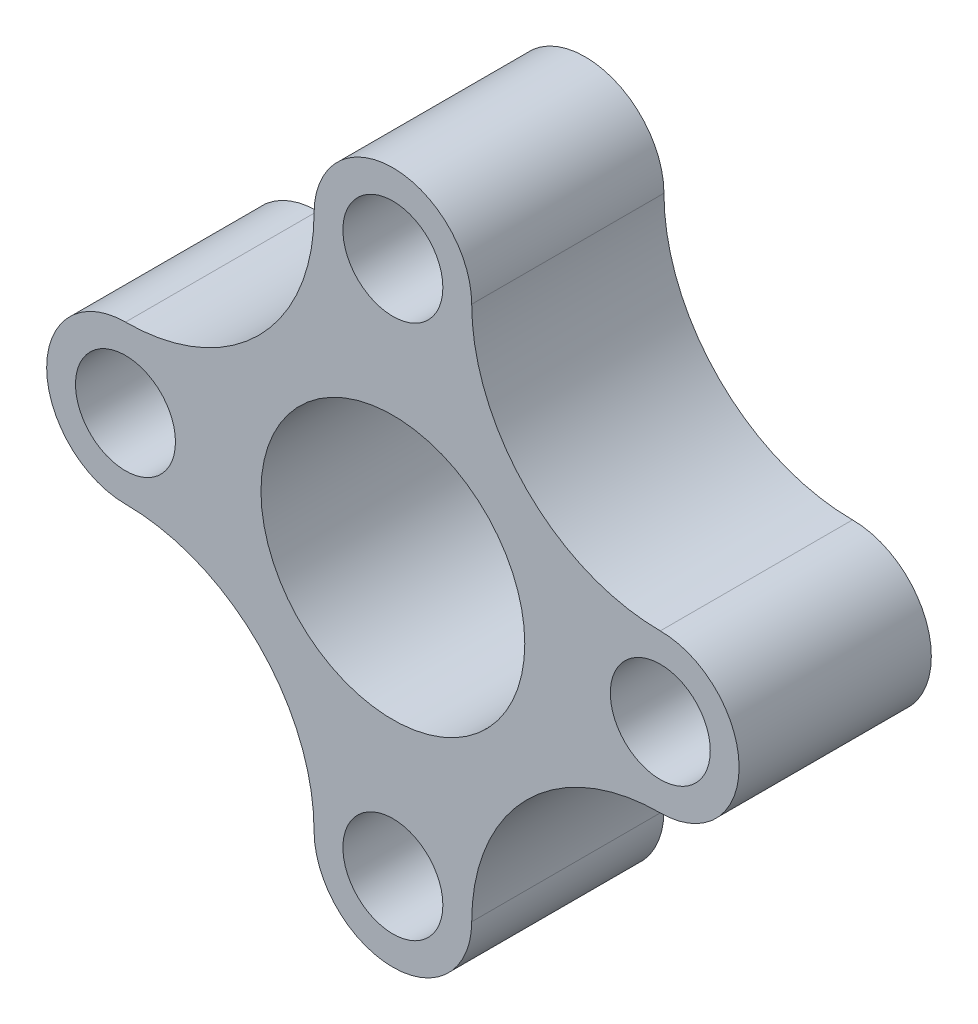
ISO-10303-21;
HEADER;
FILE_DESCRIPTION(('STEP AP214'),'2;1');
FILE_NAME('part.step','',(''),(''),'','','');
FILE_SCHEMA(('AUTOMOTIVE_DESIGN { 1 0 10303 214 1 1 1 1 }'));
ENDSEC;
DATA;
#1=APPLICATION_CONTEXT('core data for automotive mechanical design processes');
#2=APPLICATION_PROTOCOL_DEFINITION('international standard','automotive_design',2000,#1);
#3=PRODUCT_CONTEXT('',#1,'mechanical');
#4=PRODUCT('Part','Part','',(#3));
#5=PRODUCT_RELATED_PRODUCT_CATEGORY('part','',(#4));
#6=PRODUCT_DEFINITION_FORMATION('','',#4);
#7=PRODUCT_DEFINITION_CONTEXT('part definition',#1,'design');
#8=PRODUCT_DEFINITION('design','',#6,#7);
#9=PRODUCT_DEFINITION_SHAPE('','',#8);
#10=(LENGTH_UNIT() NAMED_UNIT(*) SI_UNIT(.MILLI.,.METRE.));
#11=(NAMED_UNIT(*) PLANE_ANGLE_UNIT() SI_UNIT($,.RADIAN.));
#12=(NAMED_UNIT(*) SI_UNIT($,.STERADIAN.) SOLID_ANGLE_UNIT());
#13=UNCERTAINTY_MEASURE_WITH_UNIT(LENGTH_MEASURE(1.E-05),#10,'distance_accuracy_value','');
#14=(GEOMETRIC_REPRESENTATION_CONTEXT(3) GLOBAL_UNCERTAINTY_ASSIGNED_CONTEXT((#13)) GLOBAL_UNIT_ASSIGNED_CONTEXT((#10,
#11,#12)) REPRESENTATION_CONTEXT('',''));
#15=CARTESIAN_POINT('',(0.,0.,0.));
#16=DIRECTION('',(0.,0.,1.));
#17=DIRECTION('',(1.,0.,0.));
#18=AXIS2_PLACEMENT_3D('',#15,#16,#17);
#19=CARTESIAN_POINT('',(13.9101891926553,0.,10.));
#20=DIRECTION('',(0.,0.,1.));
#21=DIRECTION('',(1.,0.,0.));
#22=AXIS2_PLACEMENT_3D('',#19,#20,#21);
#23=PLANE('',#22);
#24=CARTESIAN_POINT('',(-13.9101891926553,0.,10.));
#25=DIRECTION('',(0.,0.,1.));
#26=DIRECTION('',(1.,0.,0.));
#27=AXIS2_PLACEMENT_3D('',#24,#25,#26);
#28=CIRCLE('',#27,2.6);
#29=CARTESIAN_POINT('',(-11.3101891926553,0.,10.));
#30=VERTEX_POINT('',#29);
#31=EDGE_CURVE('E354',#30,#30,#28,.T.);
#32=ORIENTED_EDGE('',*,*,#31,.F.);
#33=EDGE_LOOP('',(#32));
#34=FACE_BOUND('',#33,.T.);
#35=CARTESIAN_POINT('',(13.9101891926553,0.,10.));
#36=DIRECTION('',(0.,0.,1.));
#37=DIRECTION('',(1.,0.,0.));
#38=AXIS2_PLACEMENT_3D('',#35,#36,#37);
#39=CIRCLE('',#38,2.6);
#40=CARTESIAN_POINT('',(16.5101891926553,0.,10.));
#41=VERTEX_POINT('',#40);
#42=EDGE_CURVE('E342',#41,#41,#39,.T.);
#43=ORIENTED_EDGE('',*,*,#42,.F.);
#44=EDGE_LOOP('',(#43));
#45=FACE_BOUND('',#44,.T.);
#46=CARTESIAN_POINT('',(0.,13.9101891926553,10.));
#47=DIRECTION('',(0.,0.,1.));
#48=DIRECTION('',(-1.,0.,0.));
#49=AXIS2_PLACEMENT_3D('',#46,#47,#48);
#50=CIRCLE('',#49,4.1);
#51=CARTESIAN_POINT('',(4.1,13.9101891926553,10.));
#52=VERTEX_POINT('',#51);
#53=CARTESIAN_POINT('',(-4.1,13.9101891926553,10.));
#54=VERTEX_POINT('',#53);
#55=EDGE_CURVE('E118',#52,#54,#50,.T.);
#56=ORIENTED_EDGE('',*,*,#55,.T.);
#57=CARTESIAN_POINT('',(-13.9101891926553,13.9101891926553,10.));
#58=DIRECTION('',(0.,0.,1.));
#59=DIRECTION('',(-1.,0.,0.));
#60=AXIS2_PLACEMENT_3D('',#57,#58,#59);
#61=CIRCLE('',#60,9.81018919265532);
#62=CARTESIAN_POINT('',(-13.9101891926553,4.1,10.));
#63=VERTEX_POINT('',#62);
#64=EDGE_CURVE('E146',#63,#54,#61,.T.);
#65=ORIENTED_EDGE('',*,*,#64,.F.);
#66=CARTESIAN_POINT('',(-13.9101891926553,0.,10.));
#67=DIRECTION('',(0.,0.,-1.));
#68=DIRECTION('',(-1.,0.,0.));
#69=AXIS2_PLACEMENT_3D('',#66,#67,#68);
#70=CIRCLE('',#69,4.1);
#71=CARTESIAN_POINT('',(-13.9101891926553,-4.1,10.));
#72=VERTEX_POINT('',#71);
#73=EDGE_CURVE('E143',#72,#63,#70,.T.);
#74=ORIENTED_EDGE('',*,*,#73,.F.);
#75=CARTESIAN_POINT('',(-13.9101891926553,-13.9101891926553,10.));
#76=DIRECTION('',(0.,0.,-1.));
#77=DIRECTION('',(-1.,0.,0.));
#78=AXIS2_PLACEMENT_3D('',#75,#76,#77);
#79=CIRCLE('',#78,9.81018919265532);
#80=CARTESIAN_POINT('',(-4.1,-13.9101891926553,10.));
#81=VERTEX_POINT('',#80);
#82=EDGE_CURVE('E159',#72,#81,#79,.T.);
#83=ORIENTED_EDGE('',*,*,#82,.T.);
#84=CARTESIAN_POINT('',(0.,-13.9101891926553,10.));
#85=DIRECTION('',(0.,0.,-1.));
#86=DIRECTION('',(-1.,0.,0.));
#87=AXIS2_PLACEMENT_3D('',#84,#85,#86);
#88=CIRCLE('',#87,4.1);
#89=CARTESIAN_POINT('',(4.1,-13.9101891926553,10.));
#90=VERTEX_POINT('',#89);
#91=EDGE_CURVE('E68',#90,#81,#88,.T.);
#92=ORIENTED_EDGE('',*,*,#91,.F.);
#93=CARTESIAN_POINT('',(13.9101891926553,-13.9101891926553,10.));
#94=DIRECTION('',(0.,0.,1.));
#95=DIRECTION('',(1.,0.,0.));
#96=AXIS2_PLACEMENT_3D('',#93,#94,#95);
#97=CIRCLE('',#96,9.81018919265532);
#98=CARTESIAN_POINT('',(13.9101891926553,-4.1,10.));
#99=VERTEX_POINT('',#98);
#100=EDGE_CURVE('E93',#99,#90,#97,.T.);
#101=ORIENTED_EDGE('',*,*,#100,.F.);
#102=CARTESIAN_POINT('',(13.9101891926553,0.,10.));
#103=DIRECTION('',(0.,0.,1.));
#104=DIRECTION('',(1.,0.,0.));
#105=AXIS2_PLACEMENT_3D('',#102,#103,#104);
#106=CIRCLE('',#105,4.1);
#107=CARTESIAN_POINT('',(13.9101891926553,4.1,10.));
#108=VERTEX_POINT('',#107);
#109=EDGE_CURVE('E114',#99,#108,#106,.T.);
#110=ORIENTED_EDGE('',*,*,#109,.T.);
#111=CARTESIAN_POINT('',(13.9101891926553,13.9101891926553,10.));
#112=DIRECTION('',(0.,0.,-1.));
#113=DIRECTION('',(1.,0.,0.));
#114=AXIS2_PLACEMENT_3D('',#111,#112,#113);
#115=CIRCLE('',#114,9.81018919265532);
#116=EDGE_CURVE('E49',#108,#52,#115,.T.);
#117=ORIENTED_EDGE('',*,*,#116,.T.);
#118=EDGE_LOOP('',(#56,#65,#74,#83,#92,#101,#110,#117));
#119=FACE_BOUND('',#118,.T.);
#120=CARTESIAN_POINT('',(0.,13.9101891926553,10.));
#121=DIRECTION('',(0.,0.,1.));
#122=DIRECTION('',(1.,0.,0.));
#123=AXIS2_PLACEMENT_3D('',#120,#121,#122);
#124=CIRCLE('',#123,2.6);
#125=CARTESIAN_POINT('',(2.6,13.9101891926553,10.));
#126=VERTEX_POINT('',#125);
#127=EDGE_CURVE('E167',#126,#126,#124,.T.);
#128=ORIENTED_EDGE('',*,*,#127,.F.);
#129=EDGE_LOOP('',(#128));
#130=FACE_BOUND('',#129,.T.);
#131=CARTESIAN_POINT('',(0.,-13.9101891926553,10.));
#132=DIRECTION('',(0.,0.,1.));
#133=DIRECTION('',(1.,0.,0.));
#134=AXIS2_PLACEMENT_3D('',#131,#132,#133);
#135=CIRCLE('',#134,2.6);
#136=CARTESIAN_POINT('',(2.6,-13.9101891926553,10.));
#137=VERTEX_POINT('',#136);
#138=EDGE_CURVE('E348',#137,#137,#135,.T.);
#139=ORIENTED_EDGE('',*,*,#138,.F.);
#140=EDGE_LOOP('',(#139));
#141=FACE_BOUND('',#140,.T.);
#142=CARTESIAN_POINT('',(0.,0.,10.));
#143=DIRECTION('',(0.,0.,1.));
#144=DIRECTION('',(1.,0.,0.));
#145=AXIS2_PLACEMENT_3D('',#142,#143,#144);
#146=CIRCLE('',#145,6.86178901877348);
#147=CARTESIAN_POINT('',(6.86178901877348,0.,10.));
#148=VERTEX_POINT('',#147);
#149=EDGE_CURVE('E360',#148,#148,#146,.T.);
#150=ORIENTED_EDGE('',*,*,#149,.F.);
#151=EDGE_LOOP('',(#150));
#152=FACE_BOUND('',#151,.T.);
#153=ADVANCED_FACE('F32',(#34,#45,#119,#130,#141,#152),#23,.T.);
#154=CARTESIAN_POINT('',(13.9101891926553,0.,0.));
#155=DIRECTION('',(0.,0.,1.));
#156=DIRECTION('',(1.,0.,0.));
#157=AXIS2_PLACEMENT_3D('',#154,#155,#156);
#158=PLANE('',#157);
#159=CARTESIAN_POINT('',(-13.9101891926553,0.,0.));
#160=DIRECTION('',(0.,0.,1.));
#161=DIRECTION('',(1.,0.,0.));
#162=AXIS2_PLACEMENT_3D('',#159,#160,#161);
#163=CIRCLE('',#162,2.6);
#164=CARTESIAN_POINT('',(-11.3101891926553,0.,0.));
#165=VERTEX_POINT('',#164);
#166=EDGE_CURVE('E357',#165,#165,#163,.T.);
#167=ORIENTED_EDGE('',*,*,#166,.T.);
#168=EDGE_LOOP('',(#167));
#169=FACE_BOUND('',#168,.T.);
#170=CARTESIAN_POINT('',(13.9101891926553,0.,0.));
#171=DIRECTION('',(0.,0.,1.));
#172=DIRECTION('',(1.,0.,0.));
#173=AXIS2_PLACEMENT_3D('',#170,#171,#172);
#174=CIRCLE('',#173,2.6);
#175=CARTESIAN_POINT('',(16.5101891926553,0.,0.));
#176=VERTEX_POINT('',#175);
#177=EDGE_CURVE('E344',#176,#176,#174,.T.);
#178=ORIENTED_EDGE('',*,*,#177,.T.);
#179=EDGE_LOOP('',(#178));
#180=FACE_BOUND('',#179,.T.);
#181=CARTESIAN_POINT('',(13.9101891926553,0.,0.));
#182=DIRECTION('',(0.,0.,1.));
#183=DIRECTION('',(1.,0.,0.));
#184=AXIS2_PLACEMENT_3D('',#181,#182,#183);
#185=CIRCLE('',#184,4.1);
#186=CARTESIAN_POINT('',(13.9101891926553,-4.1,0.));
#187=VERTEX_POINT('',#186);
#188=CARTESIAN_POINT('',(13.9101891926553,4.1,0.));
#189=VERTEX_POINT('',#188);
#190=EDGE_CURVE('E60',#187,#189,#185,.T.);
#191=ORIENTED_EDGE('',*,*,#190,.F.);
#192=CARTESIAN_POINT('',(13.9101891926553,-13.9101891926553,0.));
#193=DIRECTION('',(0.,0.,1.));
#194=DIRECTION('',(1.,0.,0.));
#195=AXIS2_PLACEMENT_3D('',#192,#193,#194);
#196=CIRCLE('',#195,9.81018919265532);
#197=CARTESIAN_POINT('',(4.1,-13.9101891926553,0.));
#198=VERTEX_POINT('',#197);
#199=EDGE_CURVE('E94',#187,#198,#196,.T.);
#200=ORIENTED_EDGE('',*,*,#199,.T.);
#201=CARTESIAN_POINT('',(0.,-13.9101891926553,0.));
#202=DIRECTION('',(0.,0.,-1.));
#203=DIRECTION('',(-1.,0.,0.));
#204=AXIS2_PLACEMENT_3D('',#201,#202,#203);
#205=CIRCLE('',#204,4.1);
#206=CARTESIAN_POINT('',(-4.1,-13.9101891926553,0.));
#207=VERTEX_POINT('',#206);
#208=EDGE_CURVE('E81',#198,#207,#205,.T.);
#209=ORIENTED_EDGE('',*,*,#208,.T.);
#210=CARTESIAN_POINT('',(-13.9101891926553,-13.9101891926553,0.));
#211=DIRECTION('',(0.,0.,-1.));
#212=DIRECTION('',(-1.,0.,0.));
#213=AXIS2_PLACEMENT_3D('',#210,#211,#212);
#214=CIRCLE('',#213,9.81018919265532);
#215=CARTESIAN_POINT('',(-13.9101891926553,-4.1,0.));
#216=VERTEX_POINT('',#215);
#217=EDGE_CURVE('E161',#216,#207,#214,.T.);
#218=ORIENTED_EDGE('',*,*,#217,.F.);
#219=CARTESIAN_POINT('',(-13.9101891926553,0.,0.));
#220=DIRECTION('',(0.,0.,-1.));
#221=DIRECTION('',(-1.,0.,0.));
#222=AXIS2_PLACEMENT_3D('',#219,#220,#221);
#223=CIRCLE('',#222,4.1);
#224=CARTESIAN_POINT('',(-13.9101891926553,4.1,0.));
#225=VERTEX_POINT('',#224);
#226=EDGE_CURVE('E139',#216,#225,#223,.T.);
#227=ORIENTED_EDGE('',*,*,#226,.T.);
#228=CARTESIAN_POINT('',(-13.9101891926553,13.9101891926553,0.));
#229=DIRECTION('',(0.,0.,1.));
#230=DIRECTION('',(-1.,0.,0.));
#231=AXIS2_PLACEMENT_3D('',#228,#229,#230);
#232=CIRCLE('',#231,9.81018919265532);
#233=CARTESIAN_POINT('',(-4.1,13.9101891926553,0.));
#234=VERTEX_POINT('',#233);
#235=EDGE_CURVE('E136',#225,#234,#232,.T.);
#236=ORIENTED_EDGE('',*,*,#235,.T.);
#237=CARTESIAN_POINT('',(0.,13.9101891926553,0.));
#238=DIRECTION('',(0.,0.,1.));
#239=DIRECTION('',(-1.,0.,0.));
#240=AXIS2_PLACEMENT_3D('',#237,#238,#239);
#241=CIRCLE('',#240,4.1);
#242=CARTESIAN_POINT('',(4.1,13.9101891926553,0.));
#243=VERTEX_POINT('',#242);
#244=EDGE_CURVE('E116',#243,#234,#241,.T.);
#245=ORIENTED_EDGE('',*,*,#244,.F.);
#246=CARTESIAN_POINT('',(13.9101891926553,13.9101891926553,0.));
#247=DIRECTION('',(0.,0.,-1.));
#248=DIRECTION('',(1.,0.,0.));
#249=AXIS2_PLACEMENT_3D('',#246,#247,#248);
#250=CIRCLE('',#249,9.81018919265532);
#251=EDGE_CURVE('E121',#189,#243,#250,.T.);
#252=ORIENTED_EDGE('',*,*,#251,.F.);
#253=EDGE_LOOP('',(#191,#200,#209,#218,#227,#236,#245,#252));
#254=FACE_BOUND('',#253,.T.);
#255=CARTESIAN_POINT('',(0.,13.9101891926553,0.));
#256=DIRECTION('',(0.,0.,1.));
#257=DIRECTION('',(1.,0.,0.));
#258=AXIS2_PLACEMENT_3D('',#255,#256,#257);
#259=CIRCLE('',#258,2.6);
#260=CARTESIAN_POINT('',(2.6,13.9101891926553,0.));
#261=VERTEX_POINT('',#260);
#262=EDGE_CURVE('E170',#261,#261,#259,.T.);
#263=ORIENTED_EDGE('',*,*,#262,.T.);
#264=EDGE_LOOP('',(#263));
#265=FACE_BOUND('',#264,.T.);
#266=CARTESIAN_POINT('',(0.,-13.9101891926553,0.));
#267=DIRECTION('',(0.,0.,1.));
#268=DIRECTION('',(1.,0.,0.));
#269=AXIS2_PLACEMENT_3D('',#266,#267,#268);
#270=CIRCLE('',#269,2.6);
#271=CARTESIAN_POINT('',(2.6,-13.9101891926553,0.));
#272=VERTEX_POINT('',#271);
#273=EDGE_CURVE('E351',#272,#272,#270,.T.);
#274=ORIENTED_EDGE('',*,*,#273,.T.);
#275=EDGE_LOOP('',(#274));
#276=FACE_BOUND('',#275,.T.);
#277=CARTESIAN_POINT('',(0.,0.,0.));
#278=DIRECTION('',(0.,0.,1.));
#279=DIRECTION('',(1.,0.,0.));
#280=AXIS2_PLACEMENT_3D('',#277,#278,#279);
#281=CIRCLE('',#280,6.86178901877348);
#282=CARTESIAN_POINT('',(6.86178901877348,0.,0.));
#283=VERTEX_POINT('',#282);
#284=EDGE_CURVE('E363',#283,#283,#281,.T.);
#285=ORIENTED_EDGE('',*,*,#284,.T.);
#286=EDGE_LOOP('',(#285));
#287=FACE_BOUND('',#286,.T.);
#288=ADVANCED_FACE('F102',(#169,#180,#254,#265,#276,#287),#158,.F.);
#289=CARTESIAN_POINT('',(13.9101891926553,0.,10.));
#290=DIRECTION('',(0.,0.,-1.));
#291=DIRECTION('',(-1.,0.,0.));
#292=AXIS2_PLACEMENT_3D('',#289,#290,#291);
#293=CYLINDRICAL_SURFACE('',#292,4.1);
#294=ORIENTED_EDGE('',*,*,#190,.T.);
#295=DIRECTION('',(0.,0.,-1.));
#296=VECTOR('',#295,1.);
#297=CARTESIAN_POINT('',(13.9101891926553,4.1,10.));
#298=LINE('',#297,#296);
#299=EDGE_CURVE('E11',#108,#189,#298,.T.);
#300=ORIENTED_EDGE('',*,*,#299,.F.);
#301=ORIENTED_EDGE('',*,*,#109,.F.);
#302=DIRECTION('',(0.,0.,-1.));
#303=VECTOR('',#302,1.);
#304=CARTESIAN_POINT('',(13.9101891926553,-4.1,10.));
#305=LINE('',#304,#303);
#306=EDGE_CURVE('E100',#99,#187,#305,.T.);
#307=ORIENTED_EDGE('',*,*,#306,.T.);
#308=EDGE_LOOP('',(#294,#300,#301,#307));
#309=FACE_BOUND('',#308,.T.);
#310=ADVANCED_FACE('F34',(#309),#293,.T.);
#311=CARTESIAN_POINT('',(13.9101891926553,13.9101891926553,10.));
#312=DIRECTION('',(0.,0.,-1.));
#313=DIRECTION('',(-1.,0.,0.));
#314=AXIS2_PLACEMENT_3D('',#311,#312,#313);
#315=CYLINDRICAL_SURFACE('',#314,9.81018919265532);
#316=ORIENTED_EDGE('',*,*,#251,.T.);
#317=DIRECTION('',(0.,0.,-1.));
#318=VECTOR('',#317,1.);
#319=CARTESIAN_POINT('',(4.1,13.9101891926553,10.));
#320=LINE('',#319,#318);
#321=EDGE_CURVE('E41',#52,#243,#320,.T.);
#322=ORIENTED_EDGE('',*,*,#321,.F.);
#323=ORIENTED_EDGE('',*,*,#116,.F.);
#324=ORIENTED_EDGE('',*,*,#299,.T.);
#325=EDGE_LOOP('',(#316,#322,#323,#324));
#326=FACE_BOUND('',#325,.T.);
#327=ADVANCED_FACE('F205',(#326),#315,.F.);
#328=CARTESIAN_POINT('',(0.,13.9101891926553,10.));
#329=DIRECTION('',(0.,0.,-1.));
#330=DIRECTION('',(-1.,0.,0.));
#331=AXIS2_PLACEMENT_3D('',#328,#329,#330);
#332=CYLINDRICAL_SURFACE('',#331,4.1);
#333=ORIENTED_EDGE('',*,*,#244,.T.);
#334=DIRECTION('',(0.,0.,-1.));
#335=VECTOR('',#334,1.);
#336=CARTESIAN_POINT('',(-4.1,13.9101891926553,10.));
#337=LINE('',#336,#335);
#338=EDGE_CURVE('E108',#54,#234,#337,.T.);
#339=ORIENTED_EDGE('',*,*,#338,.F.);
#340=ORIENTED_EDGE('',*,*,#55,.F.);
#341=ORIENTED_EDGE('',*,*,#321,.T.);
#342=EDGE_LOOP('',(#333,#339,#340,#341));
#343=FACE_BOUND('',#342,.T.);
#344=ADVANCED_FACE('F128',(#343),#332,.T.);
#345=CARTESIAN_POINT('',(13.9101891926553,-13.9101891926553,10.));
#346=DIRECTION('',(0.,0.,-1.));
#347=DIRECTION('',(-1.,0.,0.));
#348=AXIS2_PLACEMENT_3D('',#345,#346,#347);
#349=CYLINDRICAL_SURFACE('',#348,9.81018919265532);
#350=ORIENTED_EDGE('',*,*,#199,.F.);
#351=ORIENTED_EDGE('',*,*,#306,.F.);
#352=ORIENTED_EDGE('',*,*,#100,.T.);
#353=DIRECTION('',(0.,0.,-1.));
#354=VECTOR('',#353,1.);
#355=CARTESIAN_POINT('',(4.1,-13.9101891926553,10.));
#356=LINE('',#355,#354);
#357=EDGE_CURVE('E84',#90,#198,#356,.T.);
#358=ORIENTED_EDGE('',*,*,#357,.T.);
#359=EDGE_LOOP('',(#350,#351,#352,#358));
#360=FACE_BOUND('',#359,.T.);
#361=ADVANCED_FACE('F98',(#360),#349,.F.);
#362=CARTESIAN_POINT('',(0.,-13.9101891926553,10.));
#363=DIRECTION('',(0.,0.,-1.));
#364=DIRECTION('',(-1.,0.,0.));
#365=AXIS2_PLACEMENT_3D('',#362,#363,#364);
#366=CYLINDRICAL_SURFACE('',#365,4.1);
#367=ORIENTED_EDGE('',*,*,#208,.F.);
#368=ORIENTED_EDGE('',*,*,#357,.F.);
#369=ORIENTED_EDGE('',*,*,#91,.T.);
#370=DIRECTION('',(0.,0.,-1.));
#371=VECTOR('',#370,1.);
#372=CARTESIAN_POINT('',(-4.1,-13.9101891926553,10.));
#373=LINE('',#372,#371);
#374=EDGE_CURVE('E88',#81,#207,#373,.T.);
#375=ORIENTED_EDGE('',*,*,#374,.T.);
#376=EDGE_LOOP('',(#367,#368,#369,#375));
#377=FACE_BOUND('',#376,.T.);
#378=ADVANCED_FACE('F83',(#377),#366,.T.);
#379=CARTESIAN_POINT('',(-13.9101891926553,0.,10.));
#380=DIRECTION('',(0.,0.,-1.));
#381=DIRECTION('',(1.,0.,0.));
#382=AXIS2_PLACEMENT_3D('',#379,#380,#381);
#383=CYLINDRICAL_SURFACE('',#382,4.1);
#384=ORIENTED_EDGE('',*,*,#226,.F.);
#385=DIRECTION('',(0.,0.,-1.));
#386=VECTOR('',#385,1.);
#387=CARTESIAN_POINT('',(-13.9101891926553,-4.1,10.));
#388=LINE('',#387,#386);
#389=EDGE_CURVE('E148',#72,#216,#388,.T.);
#390=ORIENTED_EDGE('',*,*,#389,.F.);
#391=ORIENTED_EDGE('',*,*,#73,.T.);
#392=DIRECTION('',(0.,0.,-1.));
#393=VECTOR('',#392,1.);
#394=CARTESIAN_POINT('',(-13.9101891926553,4.1,10.));
#395=LINE('',#394,#393);
#396=EDGE_CURVE('E105',#63,#225,#395,.T.);
#397=ORIENTED_EDGE('',*,*,#396,.T.);
#398=EDGE_LOOP('',(#384,#390,#391,#397));
#399=FACE_BOUND('',#398,.T.);
#400=ADVANCED_FACE('F183',(#399),#383,.T.);
#401=CARTESIAN_POINT('',(-13.9101891926553,13.9101891926553,10.));
#402=DIRECTION('',(0.,0.,-1.));
#403=DIRECTION('',(1.,0.,0.));
#404=AXIS2_PLACEMENT_3D('',#401,#402,#403);
#405=CYLINDRICAL_SURFACE('',#404,9.81018919265532);
#406=ORIENTED_EDGE('',*,*,#235,.F.);
#407=ORIENTED_EDGE('',*,*,#396,.F.);
#408=ORIENTED_EDGE('',*,*,#64,.T.);
#409=ORIENTED_EDGE('',*,*,#338,.T.);
#410=EDGE_LOOP('',(#406,#407,#408,#409));
#411=FACE_BOUND('',#410,.T.);
#412=ADVANCED_FACE('F174',(#411),#405,.F.);
#413=CARTESIAN_POINT('',(-13.9101891926553,-13.9101891926553,10.));
#414=DIRECTION('',(0.,0.,-1.));
#415=DIRECTION('',(1.,0.,0.));
#416=AXIS2_PLACEMENT_3D('',#413,#414,#415);
#417=CYLINDRICAL_SURFACE('',#416,9.81018919265532);
#418=ORIENTED_EDGE('',*,*,#217,.T.);
#419=ORIENTED_EDGE('',*,*,#374,.F.);
#420=ORIENTED_EDGE('',*,*,#82,.F.);
#421=ORIENTED_EDGE('',*,*,#389,.T.);
#422=EDGE_LOOP('',(#418,#419,#420,#421));
#423=FACE_BOUND('',#422,.T.);
#424=ADVANCED_FACE('F157',(#423),#417,.F.);
#425=CARTESIAN_POINT('',(0.,13.9101891926553,10.));
#426=DIRECTION('',(0.,0.,-1.));
#427=DIRECTION('',(-1.,0.,0.));
#428=AXIS2_PLACEMENT_3D('',#425,#426,#427);
#429=CYLINDRICAL_SURFACE('',#428,2.6);
#430=ORIENTED_EDGE('',*,*,#127,.T.);
#431=EDGE_LOOP('',(#430));
#432=FACE_BOUND('',#431,.T.);
#433=ORIENTED_EDGE('',*,*,#262,.F.);
#434=EDGE_LOOP('',(#433));
#435=FACE_BOUND('',#434,.T.);
#436=ADVANCED_FACE('F257',(#432,#435),#429,.F.);
#437=CARTESIAN_POINT('',(13.9101891926553,0.,10.));
#438=DIRECTION('',(0.,0.,-1.));
#439=DIRECTION('',(-1.,0.,0.));
#440=AXIS2_PLACEMENT_3D('',#437,#438,#439);
#441=CYLINDRICAL_SURFACE('',#440,2.6);
#442=ORIENTED_EDGE('',*,*,#42,.T.);
#443=EDGE_LOOP('',(#442));
#444=FACE_BOUND('',#443,.T.);
#445=ORIENTED_EDGE('',*,*,#177,.F.);
#446=EDGE_LOOP('',(#445));
#447=FACE_BOUND('',#446,.T.);
#448=ADVANCED_FACE('F249',(#444,#447),#441,.F.);
#449=CARTESIAN_POINT('',(0.,-13.9101891926553,10.));
#450=DIRECTION('',(0.,0.,-1.));
#451=DIRECTION('',(-1.,0.,0.));
#452=AXIS2_PLACEMENT_3D('',#449,#450,#451);
#453=CYLINDRICAL_SURFACE('',#452,2.6);
#454=ORIENTED_EDGE('',*,*,#138,.T.);
#455=EDGE_LOOP('',(#454));
#456=FACE_BOUND('',#455,.T.);
#457=ORIENTED_EDGE('',*,*,#273,.F.);
#458=EDGE_LOOP('',(#457));
#459=FACE_BOUND('',#458,.T.);
#460=ADVANCED_FACE('F241',(#456,#459),#453,.F.);
#461=CARTESIAN_POINT('',(-13.9101891926553,0.,10.));
#462=DIRECTION('',(0.,0.,-1.));
#463=DIRECTION('',(-1.,0.,0.));
#464=AXIS2_PLACEMENT_3D('',#461,#462,#463);
#465=CYLINDRICAL_SURFACE('',#464,2.6);
#466=ORIENTED_EDGE('',*,*,#31,.T.);
#467=EDGE_LOOP('',(#466));
#468=FACE_BOUND('',#467,.T.);
#469=ORIENTED_EDGE('',*,*,#166,.F.);
#470=EDGE_LOOP('',(#469));
#471=FACE_BOUND('',#470,.T.);
#472=ADVANCED_FACE('F232',(#468,#471),#465,.F.);
#473=CARTESIAN_POINT('',(0.,0.,10.));
#474=DIRECTION('',(0.,0.,-1.));
#475=DIRECTION('',(-1.,0.,0.));
#476=AXIS2_PLACEMENT_3D('',#473,#474,#475);
#477=CYLINDRICAL_SURFACE('',#476,6.86178901877348);
#478=ORIENTED_EDGE('',*,*,#149,.T.);
#479=EDGE_LOOP('',(#478));
#480=FACE_BOUND('',#479,.T.);
#481=ORIENTED_EDGE('',*,*,#284,.F.);
#482=EDGE_LOOP('',(#481));
#483=FACE_BOUND('',#482,.T.);
#484=ADVANCED_FACE('F228',(#480,#483),#477,.F.);
#485=CLOSED_SHELL('',(#153,#288,#310,#327,#344,#361,#378,#400,#412,#424,#436,#448,#460,#472,#484));
#486=MANIFOLD_SOLID_BREP('B2',#485);
#487=ADVANCED_BREP_SHAPE_REPRESENTATION('',(#18,#486),#14);
#488=SHAPE_DEFINITION_REPRESENTATION(#9,#487);
ENDSEC;
END-ISO-10303-21;
